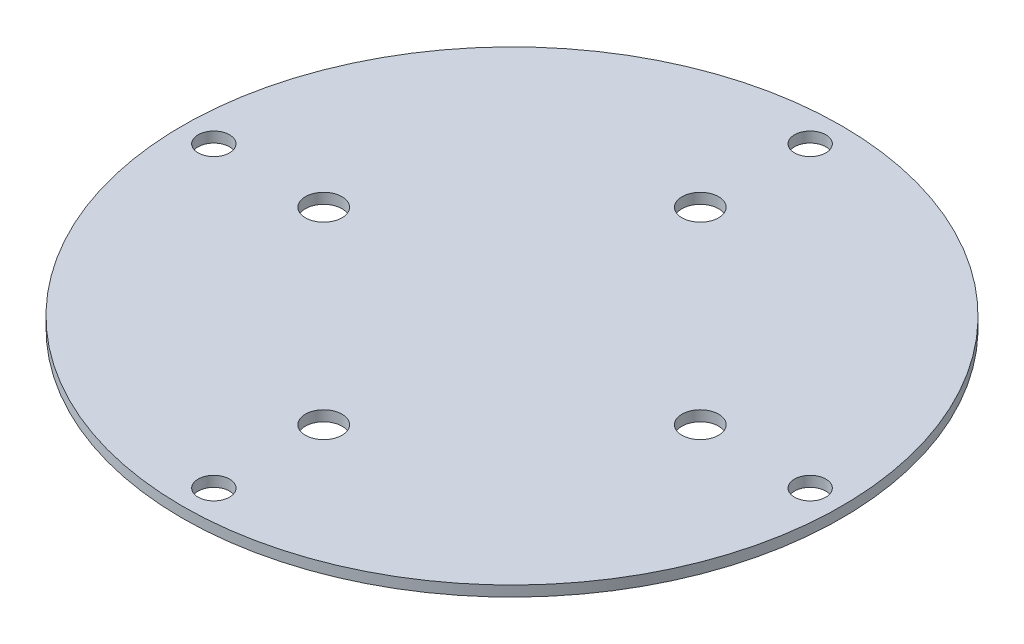
ISO-10303-21;
HEADER;
FILE_DESCRIPTION(('STEP AP214'),'2;1');
FILE_NAME('part.step','',(''),(''),'','','');
FILE_SCHEMA(('AUTOMOTIVE_DESIGN { 1 0 10303 214 1 1 1 1 }'));
ENDSEC;
DATA;
#1=APPLICATION_CONTEXT('core data for automotive mechanical design processes');
#2=APPLICATION_PROTOCOL_DEFINITION('international standard','automotive_design',2000,#1);
#3=PRODUCT_CONTEXT('',#1,'mechanical');
#4=PRODUCT('Part','Part','',(#3));
#5=PRODUCT_RELATED_PRODUCT_CATEGORY('part','',(#4));
#6=PRODUCT_DEFINITION_FORMATION('','',#4);
#7=PRODUCT_DEFINITION_CONTEXT('part definition',#1,'design');
#8=PRODUCT_DEFINITION('design','',#6,#7);
#9=PRODUCT_DEFINITION_SHAPE('','',#8);
#10=(LENGTH_UNIT() NAMED_UNIT(*) SI_UNIT(.MILLI.,.METRE.));
#11=(NAMED_UNIT(*) PLANE_ANGLE_UNIT() SI_UNIT($,.RADIAN.));
#12=(NAMED_UNIT(*) SI_UNIT($,.STERADIAN.) SOLID_ANGLE_UNIT());
#13=UNCERTAINTY_MEASURE_WITH_UNIT(LENGTH_MEASURE(1.E-05),#10,'distance_accuracy_value','');
#14=(GEOMETRIC_REPRESENTATION_CONTEXT(3) GLOBAL_UNCERTAINTY_ASSIGNED_CONTEXT((#13)) GLOBAL_UNIT_ASSIGNED_CONTEXT((#10,
#11,#12)) REPRESENTATION_CONTEXT('',''));
#15=CARTESIAN_POINT('',(0.,0.,0.));
#16=DIRECTION('',(0.,0.,1.));
#17=DIRECTION('',(1.,0.,0.));
#18=AXIS2_PLACEMENT_3D('',#15,#16,#17);
#19=CARTESIAN_POINT('',(2.98521654471088E-13,1.,-28.5));
#20=DIRECTION('',(0.,-1.,0.));
#21=DIRECTION('',(0.,0.,-1.));
#22=AXIS2_PLACEMENT_3D('',#19,#20,#21);
#23=CYLINDRICAL_SURFACE('',#22,1.5);
#24=CARTESIAN_POINT('',(2.98521654471088E-13,1.,-28.5));
#25=DIRECTION('',(0.,1.,0.));
#26=DIRECTION('',(0.,0.,1.));
#27=AXIS2_PLACEMENT_3D('',#24,#25,#26);
#28=CIRCLE('',#27,1.5);
#29=CARTESIAN_POINT('',(2.98521654471088E-13,1.,-27.));
#30=VERTEX_POINT('',#29);
#31=EDGE_CURVE('E40',#30,#30,#28,.T.);
#32=ORIENTED_EDGE('',*,*,#31,.T.);
#33=EDGE_LOOP('',(#32));
#34=FACE_BOUND('',#33,.T.);
#35=CARTESIAN_POINT('',(2.98521654471088E-13,0.,-28.5));
#36=DIRECTION('',(0.,1.,0.));
#37=DIRECTION('',(0.,0.,1.));
#38=AXIS2_PLACEMENT_3D('',#35,#36,#37);
#39=CIRCLE('',#38,1.5);
#40=CARTESIAN_POINT('',(2.98521654471088E-13,0.,-27.));
#41=VERTEX_POINT('',#40);
#42=EDGE_CURVE('E69',#41,#41,#39,.T.);
#43=ORIENTED_EDGE('',*,*,#42,.F.);
#44=EDGE_LOOP('',(#43));
#45=FACE_BOUND('',#44,.T.);
#46=ADVANCED_FACE('F32',(#34,#45),#23,.F.);
#47=CARTESIAN_POINT('',(-1.88539992297529E-13,1.,18.));
#48=DIRECTION('',(0.,-1.,0.));
#49=DIRECTION('',(0.,0.,-1.));
#50=AXIS2_PLACEMENT_3D('',#47,#48,#49);
#51=CYLINDRICAL_SURFACE('',#50,1.75);
#52=CARTESIAN_POINT('',(-1.88539992297529E-13,1.,18.));
#53=DIRECTION('',(0.,1.,0.));
#54=DIRECTION('',(0.,0.,1.));
#55=AXIS2_PLACEMENT_3D('',#52,#53,#54);
#56=CIRCLE('',#55,1.75);
#57=CARTESIAN_POINT('',(-1.88539992297529E-13,1.,19.75));
#58=VERTEX_POINT('',#57);
#59=EDGE_CURVE('E45',#58,#58,#56,.T.);
#60=ORIENTED_EDGE('',*,*,#59,.T.);
#61=EDGE_LOOP('',(#60));
#62=FACE_BOUND('',#61,.T.);
#63=CARTESIAN_POINT('',(-1.88539992297529E-13,0.,18.));
#64=DIRECTION('',(0.,1.,0.));
#65=DIRECTION('',(0.,0.,1.));
#66=AXIS2_PLACEMENT_3D('',#63,#64,#65);
#67=CIRCLE('',#66,1.75);
#68=CARTESIAN_POINT('',(-1.88539992297529E-13,0.,19.75));
#69=VERTEX_POINT('',#68);
#70=EDGE_CURVE('E67',#69,#69,#67,.T.);
#71=ORIENTED_EDGE('',*,*,#70,.F.);
#72=EDGE_LOOP('',(#71));
#73=FACE_BOUND('',#72,.T.);
#74=ADVANCED_FACE('F99',(#62,#73),#51,.F.);
#75=CARTESIAN_POINT('',(-18.,1.,0.));
#76=DIRECTION('',(0.,-1.,0.));
#77=DIRECTION('',(0.,0.,-1.));
#78=AXIS2_PLACEMENT_3D('',#75,#76,#77);
#79=CYLINDRICAL_SURFACE('',#78,1.75);
#80=CARTESIAN_POINT('',(-18.,1.,0.));
#81=DIRECTION('',(0.,1.,0.));
#82=DIRECTION('',(0.,0.,1.));
#83=AXIS2_PLACEMENT_3D('',#80,#81,#82);
#84=CIRCLE('',#83,1.75);
#85=CARTESIAN_POINT('',(-18.,1.,1.75));
#86=VERTEX_POINT('',#85);
#87=EDGE_CURVE('E94',#86,#86,#84,.T.);
#88=ORIENTED_EDGE('',*,*,#87,.T.);
#89=EDGE_LOOP('',(#88));
#90=FACE_BOUND('',#89,.T.);
#91=CARTESIAN_POINT('',(-18.,0.,0.));
#92=DIRECTION('',(0.,1.,0.));
#93=DIRECTION('',(0.,0.,1.));
#94=AXIS2_PLACEMENT_3D('',#91,#92,#93);
#95=CIRCLE('',#94,1.75);
#96=CARTESIAN_POINT('',(-18.,0.,1.75));
#97=VERTEX_POINT('',#96);
#98=EDGE_CURVE('E64',#97,#97,#95,.T.);
#99=ORIENTED_EDGE('',*,*,#98,.F.);
#100=EDGE_LOOP('',(#99));
#101=FACE_BOUND('',#100,.T.);
#102=ADVANCED_FACE('F117',(#90,#101),#79,.F.);
#103=CARTESIAN_POINT('',(0.,1.,-18.));
#104=DIRECTION('',(0.,-1.,0.));
#105=DIRECTION('',(0.,0.,-1.));
#106=AXIS2_PLACEMENT_3D('',#103,#104,#105);
#107=CYLINDRICAL_SURFACE('',#106,1.75);
#108=CARTESIAN_POINT('',(0.,1.,-18.));
#109=DIRECTION('',(0.,1.,0.));
#110=DIRECTION('',(0.,0.,1.));
#111=AXIS2_PLACEMENT_3D('',#108,#109,#110);
#112=CIRCLE('',#111,1.75);
#113=CARTESIAN_POINT('',(0.,1.,-16.25));
#114=VERTEX_POINT('',#113);
#115=EDGE_CURVE('E91',#114,#114,#112,.T.);
#116=ORIENTED_EDGE('',*,*,#115,.T.);
#117=EDGE_LOOP('',(#116));
#118=FACE_BOUND('',#117,.T.);
#119=CARTESIAN_POINT('',(0.,0.,-18.));
#120=DIRECTION('',(0.,1.,0.));
#121=DIRECTION('',(0.,0.,1.));
#122=AXIS2_PLACEMENT_3D('',#119,#120,#121);
#123=CIRCLE('',#122,1.75);
#124=CARTESIAN_POINT('',(0.,0.,-16.25));
#125=VERTEX_POINT('',#124);
#126=EDGE_CURVE('E61',#125,#125,#123,.T.);
#127=ORIENTED_EDGE('',*,*,#126,.F.);
#128=EDGE_LOOP('',(#127));
#129=FACE_BOUND('',#128,.T.);
#130=ADVANCED_FACE('F124',(#118,#129),#107,.F.);
#131=CARTESIAN_POINT('',(18.,1.,1.25693328198353E-13));
#132=DIRECTION('',(0.,-1.,0.));
#133=DIRECTION('',(0.,0.,-1.));
#134=AXIS2_PLACEMENT_3D('',#131,#132,#133);
#135=CYLINDRICAL_SURFACE('',#134,1.75);
#136=CARTESIAN_POINT('',(18.,1.,1.25693328198353E-13));
#137=DIRECTION('',(0.,1.,0.));
#138=DIRECTION('',(0.,0.,1.));
#139=AXIS2_PLACEMENT_3D('',#136,#137,#138);
#140=CIRCLE('',#139,1.75);
#141=CARTESIAN_POINT('',(18.,1.,1.75000000000013));
#142=VERTEX_POINT('',#141);
#143=EDGE_CURVE('E88',#142,#142,#140,.T.);
#144=ORIENTED_EDGE('',*,*,#143,.T.);
#145=EDGE_LOOP('',(#144));
#146=FACE_BOUND('',#145,.T.);
#147=CARTESIAN_POINT('',(18.,0.,1.25693328198353E-13));
#148=DIRECTION('',(0.,1.,0.));
#149=DIRECTION('',(0.,0.,1.));
#150=AXIS2_PLACEMENT_3D('',#147,#148,#149);
#151=CIRCLE('',#150,1.75);
#152=CARTESIAN_POINT('',(18.,0.,1.75000000000013));
#153=VERTEX_POINT('',#152);
#154=EDGE_CURVE('E58',#153,#153,#151,.T.);
#155=ORIENTED_EDGE('',*,*,#154,.F.);
#156=EDGE_LOOP('',(#155));
#157=FACE_BOUND('',#156,.T.);
#158=ADVANCED_FACE('F128',(#146,#157),#135,.F.);
#159=CARTESIAN_POINT('',(28.5,1.,0.));
#160=DIRECTION('',(0.,-1.,0.));
#161=DIRECTION('',(0.,0.,-1.));
#162=AXIS2_PLACEMENT_3D('',#159,#160,#161);
#163=CYLINDRICAL_SURFACE('',#162,1.5);
#164=CARTESIAN_POINT('',(28.5,1.,0.));
#165=DIRECTION('',(0.,1.,0.));
#166=DIRECTION('',(0.,0.,1.));
#167=AXIS2_PLACEMENT_3D('',#164,#165,#166);
#168=CIRCLE('',#167,1.5);
#169=CARTESIAN_POINT('',(28.5,1.,1.5));
#170=VERTEX_POINT('',#169);
#171=EDGE_CURVE('E83',#170,#170,#168,.T.);
#172=ORIENTED_EDGE('',*,*,#171,.T.);
#173=EDGE_LOOP('',(#172));
#174=FACE_BOUND('',#173,.T.);
#175=CARTESIAN_POINT('',(28.5,0.,0.));
#176=DIRECTION('',(0.,1.,0.));
#177=DIRECTION('',(0.,0.,1.));
#178=AXIS2_PLACEMENT_3D('',#175,#176,#177);
#179=CIRCLE('',#178,1.5);
#180=CARTESIAN_POINT('',(28.5,0.,1.5));
#181=VERTEX_POINT('',#180);
#182=EDGE_CURVE('E55',#181,#181,#179,.T.);
#183=ORIENTED_EDGE('',*,*,#182,.F.);
#184=EDGE_LOOP('',(#183));
#185=FACE_BOUND('',#184,.T.);
#186=ADVANCED_FACE('F132',(#174,#185),#163,.F.);
#187=CARTESIAN_POINT('',(0.,1.,28.5));
#188=DIRECTION('',(0.,-1.,0.));
#189=DIRECTION('',(0.,0.,-1.));
#190=AXIS2_PLACEMENT_3D('',#187,#188,#189);
#191=CYLINDRICAL_SURFACE('',#190,1.5);
#192=CARTESIAN_POINT('',(0.,1.,28.5));
#193=DIRECTION('',(0.,1.,0.));
#194=DIRECTION('',(0.,0.,1.));
#195=AXIS2_PLACEMENT_3D('',#192,#193,#194);
#196=CIRCLE('',#195,1.5);
#197=CARTESIAN_POINT('',(0.,1.,30.));
#198=VERTEX_POINT('',#197);
#199=EDGE_CURVE('E78',#198,#198,#196,.T.);
#200=ORIENTED_EDGE('',*,*,#199,.T.);
#201=EDGE_LOOP('',(#200));
#202=FACE_BOUND('',#201,.T.);
#203=CARTESIAN_POINT('',(0.,0.,28.5));
#204=DIRECTION('',(0.,1.,0.));
#205=DIRECTION('',(0.,0.,1.));
#206=AXIS2_PLACEMENT_3D('',#203,#204,#205);
#207=CIRCLE('',#206,1.5);
#208=CARTESIAN_POINT('',(0.,0.,30.));
#209=VERTEX_POINT('',#208);
#210=EDGE_CURVE('E52',#209,#209,#207,.T.);
#211=ORIENTED_EDGE('',*,*,#210,.F.);
#212=EDGE_LOOP('',(#211));
#213=FACE_BOUND('',#212,.T.);
#214=ADVANCED_FACE('F135',(#202,#213),#191,.F.);
#215=CARTESIAN_POINT('',(-28.5,1.,-1.99014436314059E-13));
#216=DIRECTION('',(0.,-1.,0.));
#217=DIRECTION('',(0.,0.,-1.));
#218=AXIS2_PLACEMENT_3D('',#215,#216,#217);
#219=CYLINDRICAL_SURFACE('',#218,1.5);
#220=CARTESIAN_POINT('',(-28.5,1.,-1.99014436314059E-13));
#221=DIRECTION('',(0.,1.,0.));
#222=DIRECTION('',(0.,0.,1.));
#223=AXIS2_PLACEMENT_3D('',#220,#221,#222);
#224=CIRCLE('',#223,1.5);
#225=CARTESIAN_POINT('',(-28.5,1.,1.4999999999998));
#226=VERTEX_POINT('',#225);
#227=EDGE_CURVE('E74',#226,#226,#224,.T.);
#228=ORIENTED_EDGE('',*,*,#227,.T.);
#229=EDGE_LOOP('',(#228));
#230=FACE_BOUND('',#229,.T.);
#231=CARTESIAN_POINT('',(-28.5,0.,-1.99014436314059E-13));
#232=DIRECTION('',(0.,1.,0.));
#233=DIRECTION('',(0.,0.,1.));
#234=AXIS2_PLACEMENT_3D('',#231,#232,#233);
#235=CIRCLE('',#234,1.5);
#236=CARTESIAN_POINT('',(-28.5,0.,1.4999999999998));
#237=VERTEX_POINT('',#236);
#238=EDGE_CURVE('E49',#237,#237,#235,.T.);
#239=ORIENTED_EDGE('',*,*,#238,.F.);
#240=EDGE_LOOP('',(#239));
#241=FACE_BOUND('',#240,.T.);
#242=ADVANCED_FACE('F34',(#230,#241),#219,.F.);
#243=CARTESIAN_POINT('',(0.,1.,0.));
#244=DIRECTION('',(0.,-1.,0.));
#245=DIRECTION('',(0.,0.,-1.));
#246=AXIS2_PLACEMENT_3D('',#243,#244,#245);
#247=CYLINDRICAL_SURFACE('',#246,31.5);
#248=CARTESIAN_POINT('',(0.,1.,0.));
#249=DIRECTION('',(0.,1.,0.));
#250=DIRECTION('',(0.,0.,1.));
#251=AXIS2_PLACEMENT_3D('',#248,#249,#250);
#252=CIRCLE('',#251,31.5);
#253=CARTESIAN_POINT('',(0.,1.,31.5));
#254=VERTEX_POINT('',#253);
#255=EDGE_CURVE('E10',#254,#254,#252,.T.);
#256=ORIENTED_EDGE('',*,*,#255,.F.);
#257=EDGE_LOOP('',(#256));
#258=FACE_BOUND('',#257,.T.);
#259=CARTESIAN_POINT('',(0.,0.,0.));
#260=DIRECTION('',(0.,1.,0.));
#261=DIRECTION('',(0.,0.,1.));
#262=AXIS2_PLACEMENT_3D('',#259,#260,#261);
#263=CIRCLE('',#262,31.5);
#264=CARTESIAN_POINT('',(0.,0.,31.5));
#265=VERTEX_POINT('',#264);
#266=EDGE_CURVE('E36',#265,#265,#263,.T.);
#267=ORIENTED_EDGE('',*,*,#266,.T.);
#268=EDGE_LOOP('',(#267));
#269=FACE_BOUND('',#268,.T.);
#270=ADVANCED_FACE('F106',(#258,#269),#247,.T.);
#271=CARTESIAN_POINT('',(0.,1.,0.));
#272=DIRECTION('',(0.,1.,0.));
#273=DIRECTION('',(0.,0.,1.));
#274=AXIS2_PLACEMENT_3D('',#271,#272,#273);
#275=PLANE('',#274);
#276=ORIENTED_EDGE('',*,*,#227,.F.);
#277=EDGE_LOOP('',(#276));
#278=FACE_BOUND('',#277,.T.);
#279=ORIENTED_EDGE('',*,*,#199,.F.);
#280=EDGE_LOOP('',(#279));
#281=FACE_BOUND('',#280,.T.);
#282=ORIENTED_EDGE('',*,*,#171,.F.);
#283=EDGE_LOOP('',(#282));
#284=FACE_BOUND('',#283,.T.);
#285=ORIENTED_EDGE('',*,*,#143,.F.);
#286=EDGE_LOOP('',(#285));
#287=FACE_BOUND('',#286,.T.);
#288=ORIENTED_EDGE('',*,*,#115,.F.);
#289=EDGE_LOOP('',(#288));
#290=FACE_BOUND('',#289,.T.);
#291=ORIENTED_EDGE('',*,*,#87,.F.);
#292=EDGE_LOOP('',(#291));
#293=FACE_BOUND('',#292,.T.);
#294=ORIENTED_EDGE('',*,*,#59,.F.);
#295=EDGE_LOOP('',(#294));
#296=FACE_BOUND('',#295,.T.);
#297=ORIENTED_EDGE('',*,*,#31,.F.);
#298=EDGE_LOOP('',(#297));
#299=FACE_BOUND('',#298,.T.);
#300=ORIENTED_EDGE('',*,*,#255,.T.);
#301=EDGE_LOOP('',(#300));
#302=FACE_BOUND('',#301,.T.);
#303=ADVANCED_FACE('F102',(#278,#281,#284,#287,#290,#293,#296,#299,#302),#275,.T.);
#304=CARTESIAN_POINT('',(0.,0.,0.));
#305=DIRECTION('',(0.,1.,0.));
#306=DIRECTION('',(0.,0.,1.));
#307=AXIS2_PLACEMENT_3D('',#304,#305,#306);
#308=PLANE('',#307);
#309=ORIENTED_EDGE('',*,*,#238,.T.);
#310=EDGE_LOOP('',(#309));
#311=FACE_BOUND('',#310,.T.);
#312=ORIENTED_EDGE('',*,*,#210,.T.);
#313=EDGE_LOOP('',(#312));
#314=FACE_BOUND('',#313,.T.);
#315=ORIENTED_EDGE('',*,*,#182,.T.);
#316=EDGE_LOOP('',(#315));
#317=FACE_BOUND('',#316,.T.);
#318=ORIENTED_EDGE('',*,*,#154,.T.);
#319=EDGE_LOOP('',(#318));
#320=FACE_BOUND('',#319,.T.);
#321=ORIENTED_EDGE('',*,*,#126,.T.);
#322=EDGE_LOOP('',(#321));
#323=FACE_BOUND('',#322,.T.);
#324=ORIENTED_EDGE('',*,*,#98,.T.);
#325=EDGE_LOOP('',(#324));
#326=FACE_BOUND('',#325,.T.);
#327=ORIENTED_EDGE('',*,*,#70,.T.);
#328=EDGE_LOOP('',(#327));
#329=FACE_BOUND('',#328,.T.);
#330=ORIENTED_EDGE('',*,*,#42,.T.);
#331=EDGE_LOOP('',(#330));
#332=FACE_BOUND('',#331,.T.);
#333=ORIENTED_EDGE('',*,*,#266,.F.);
#334=EDGE_LOOP('',(#333));
#335=FACE_BOUND('',#334,.T.);
#336=ADVANCED_FACE('F105',(#311,#314,#317,#320,#323,#326,#329,#332,#335),#308,.F.);
#337=CLOSED_SHELL('',(#46,#74,#102,#130,#158,#186,#214,#242,#270,#303,#336));
#338=MANIFOLD_SOLID_BREP('B2',#337);
#339=ADVANCED_BREP_SHAPE_REPRESENTATION('',(#18,#338),#14);
#340=SHAPE_DEFINITION_REPRESENTATION(#9,#339);
ENDSEC;
END-ISO-10303-21;
